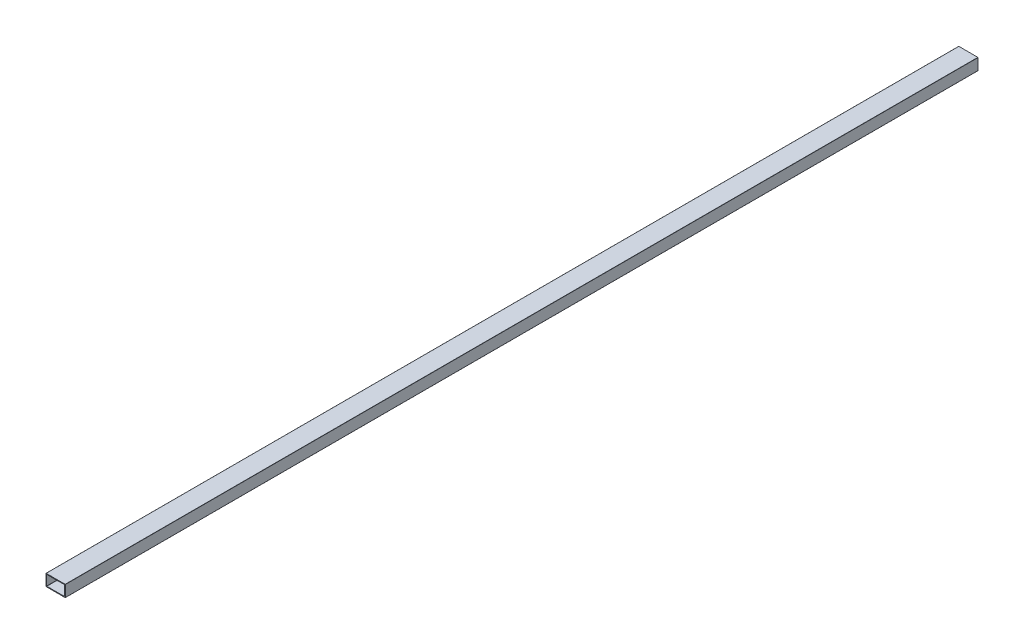
ISO-10303-21;
HEADER;
FILE_DESCRIPTION(('STEP AP214'),'2;1');
FILE_NAME('part.step','',(''),(''),'','','');
FILE_SCHEMA(('AUTOMOTIVE_DESIGN { 1 0 10303 214 1 1 1 1 }'));
ENDSEC;
DATA;
#1=APPLICATION_CONTEXT('core data for automotive mechanical design processes');
#2=APPLICATION_PROTOCOL_DEFINITION('international standard','automotive_design',2000,#1);
#3=PRODUCT_CONTEXT('',#1,'mechanical');
#4=PRODUCT('Part','Part','',(#3));
#5=PRODUCT_RELATED_PRODUCT_CATEGORY('part','',(#4));
#6=PRODUCT_DEFINITION_FORMATION('','',#4);
#7=PRODUCT_DEFINITION_CONTEXT('part definition',#1,'design');
#8=PRODUCT_DEFINITION('design','',#6,#7);
#9=PRODUCT_DEFINITION_SHAPE('','',#8);
#10=(LENGTH_UNIT() NAMED_UNIT(*) SI_UNIT(.MILLI.,.METRE.));
#11=(NAMED_UNIT(*) PLANE_ANGLE_UNIT() SI_UNIT($,.RADIAN.));
#12=(NAMED_UNIT(*) SI_UNIT($,.STERADIAN.) SOLID_ANGLE_UNIT());
#13=UNCERTAINTY_MEASURE_WITH_UNIT(LENGTH_MEASURE(1.E-05),#10,'distance_accuracy_value','');
#14=(GEOMETRIC_REPRESENTATION_CONTEXT(3) GLOBAL_UNCERTAINTY_ASSIGNED_CONTEXT((#13)) GLOBAL_UNIT_ASSIGNED_CONTEXT((#10,
#11,#12)) REPRESENTATION_CONTEXT('',''));
#15=CARTESIAN_POINT('',(0.,0.,0.));
#16=DIRECTION('',(0.,0.,1.));
#17=DIRECTION('',(1.,0.,0.));
#18=AXIS2_PLACEMENT_3D('',#15,#16,#17);
#19=CARTESIAN_POINT('',(63.5,-38.1,-6000.));
#20=DIRECTION('',(1.,0.,0.));
#21=DIRECTION('',(0.,0.,-1.));
#22=AXIS2_PLACEMENT_3D('',#19,#20,#21);
#23=PLANE('',#22);
#24=DIRECTION('',(0.,1.,0.));
#25=VECTOR('',#24,1.);
#26=CARTESIAN_POINT('',(63.5,-38.1,0.));
#27=LINE('',#26,#25);
#28=CARTESIAN_POINT('',(63.5,-37.1,0.));
#29=VERTEX_POINT('',#28);
#30=CARTESIAN_POINT('',(63.5,37.1,0.));
#31=VERTEX_POINT('',#30);
#32=EDGE_CURVE('E197',#29,#31,#27,.T.);
#33=ORIENTED_EDGE('',*,*,#32,.F.);
#34=DIRECTION('',(0.,0.,1.));
#35=VECTOR('',#34,1.);
#36=CARTESIAN_POINT('',(63.5,-37.1,-6000.));
#37=LINE('',#36,#35);
#38=CARTESIAN_POINT('',(63.5,-37.1,-6000.));
#39=VERTEX_POINT('',#38);
#40=EDGE_CURVE('E158',#29,#39,#37,.F.);
#41=ORIENTED_EDGE('',*,*,#40,.T.);
#42=DIRECTION('',(0.,1.,0.));
#43=VECTOR('',#42,1.);
#44=CARTESIAN_POINT('',(63.5,-38.1,-6000.));
#45=LINE('',#44,#43);
#46=CARTESIAN_POINT('',(63.5,37.1,-6000.));
#47=VERTEX_POINT('',#46);
#48=EDGE_CURVE('E185',#39,#47,#45,.T.);
#49=ORIENTED_EDGE('',*,*,#48,.T.);
#50=DIRECTION('',(0.,0.,1.));
#51=VECTOR('',#50,1.);
#52=CARTESIAN_POINT('',(63.5,37.1,-6000.));
#53=LINE('',#52,#51);
#54=EDGE_CURVE('E251',#47,#31,#53,.T.);
#55=ORIENTED_EDGE('',*,*,#54,.T.);
#56=EDGE_LOOP('',(#33,#41,#49,#55));
#57=FACE_BOUND('',#56,.T.);
#58=ADVANCED_FACE('F33',(#57),#23,.T.);
#59=CARTESIAN_POINT('',(-63.5,-38.1,-6000.));
#60=DIRECTION('',(0.,-1.,0.));
#61=DIRECTION('',(0.,0.,-1.));
#62=AXIS2_PLACEMENT_3D('',#59,#60,#61);
#63=PLANE('',#62);
#64=DIRECTION('',(1.,0.,0.));
#65=VECTOR('',#64,1.);
#66=CARTESIAN_POINT('',(-63.5,-38.1,0.));
#67=LINE('',#66,#65);
#68=CARTESIAN_POINT('',(-62.5,-38.1,0.));
#69=VERTEX_POINT('',#68);
#70=CARTESIAN_POINT('',(62.5,-38.1,0.));
#71=VERTEX_POINT('',#70);
#72=EDGE_CURVE('E189',#69,#71,#67,.T.);
#73=ORIENTED_EDGE('',*,*,#72,.F.);
#74=DIRECTION('',(0.,0.,1.));
#75=VECTOR('',#74,1.);
#76=CARTESIAN_POINT('',(-62.5,-38.1,-6000.));
#77=LINE('',#76,#75);
#78=CARTESIAN_POINT('',(-62.5,-38.1,-6000.));
#79=VERTEX_POINT('',#78);
#80=EDGE_CURVE('E238',#69,#79,#77,.F.);
#81=ORIENTED_EDGE('',*,*,#80,.T.);
#82=DIRECTION('',(1.,0.,0.));
#83=VECTOR('',#82,1.);
#84=CARTESIAN_POINT('',(-63.5,-38.1,-6000.));
#85=LINE('',#84,#83);
#86=CARTESIAN_POINT('',(62.5,-38.1,-6000.));
#87=VERTEX_POINT('',#86);
#88=EDGE_CURVE('E194',#79,#87,#85,.T.);
#89=ORIENTED_EDGE('',*,*,#88,.T.);
#90=DIRECTION('',(0.,0.,1.));
#91=VECTOR('',#90,1.);
#92=CARTESIAN_POINT('',(62.5,-38.1,-6000.));
#93=LINE('',#92,#91);
#94=EDGE_CURVE('E235',#87,#71,#93,.T.);
#95=ORIENTED_EDGE('',*,*,#94,.T.);
#96=EDGE_LOOP('',(#73,#81,#89,#95));
#97=FACE_BOUND('',#96,.T.);
#98=ADVANCED_FACE('F305',(#97),#63,.T.);
#99=CARTESIAN_POINT('',(-63.5,-38.1,-6000.));
#100=DIRECTION('',(-1.,0.,0.));
#101=DIRECTION('',(0.,0.,1.));
#102=AXIS2_PLACEMENT_3D('',#99,#100,#101);
#103=PLANE('',#102);
#104=DIRECTION('',(0.,-1.,0.));
#105=VECTOR('',#104,1.);
#106=CARTESIAN_POINT('',(-63.5,-38.1,-6000.));
#107=LINE('',#106,#105);
#108=CARTESIAN_POINT('',(-63.5,37.1,-6000.));
#109=VERTEX_POINT('',#108);
#110=CARTESIAN_POINT('',(-63.5,-37.1,-6000.));
#111=VERTEX_POINT('',#110);
#112=EDGE_CURVE('E191',#109,#111,#107,.T.);
#113=ORIENTED_EDGE('',*,*,#112,.T.);
#114=DIRECTION('',(0.,0.,1.));
#115=VECTOR('',#114,1.);
#116=CARTESIAN_POINT('',(-63.5,-37.1,-6000.));
#117=LINE('',#116,#115);
#118=CARTESIAN_POINT('',(-63.5,-37.1,0.));
#119=VERTEX_POINT('',#118);
#120=EDGE_CURVE('E224',#111,#119,#117,.T.);
#121=ORIENTED_EDGE('',*,*,#120,.T.);
#122=DIRECTION('',(0.,-1.,0.));
#123=VECTOR('',#122,1.);
#124=CARTESIAN_POINT('',(-63.5,-38.1,0.));
#125=LINE('',#124,#123);
#126=CARTESIAN_POINT('',(-63.5,37.1,0.));
#127=VERTEX_POINT('',#126);
#128=EDGE_CURVE('E203',#127,#119,#125,.T.);
#129=ORIENTED_EDGE('',*,*,#128,.F.);
#130=DIRECTION('',(0.,0.,1.));
#131=VECTOR('',#130,1.);
#132=CARTESIAN_POINT('',(-63.5,37.1,-6000.));
#133=LINE('',#132,#131);
#134=EDGE_CURVE('E222',#127,#109,#133,.F.);
#135=ORIENTED_EDGE('',*,*,#134,.T.);
#136=EDGE_LOOP('',(#113,#121,#129,#135));
#137=FACE_BOUND('',#136,.T.);
#138=ADVANCED_FACE('F311',(#137),#103,.T.);
#139=CARTESIAN_POINT('',(-63.5,38.1,-6000.));
#140=DIRECTION('',(0.,1.,0.));
#141=DIRECTION('',(0.,0.,1.));
#142=AXIS2_PLACEMENT_3D('',#139,#140,#141);
#143=PLANE('',#142);
#144=DIRECTION('',(-1.,0.,0.));
#145=VECTOR('',#144,1.);
#146=CARTESIAN_POINT('',(-63.5,38.1,-6000.));
#147=LINE('',#146,#145);
#148=CARTESIAN_POINT('',(62.5,38.1,-6000.));
#149=VERTEX_POINT('',#148);
#150=CARTESIAN_POINT('',(-62.5,38.1,-6000.));
#151=VERTEX_POINT('',#150);
#152=EDGE_CURVE('E188',#149,#151,#147,.T.);
#153=ORIENTED_EDGE('',*,*,#152,.T.);
#154=DIRECTION('',(0.,0.,1.));
#155=VECTOR('',#154,1.);
#156=CARTESIAN_POINT('',(-62.5,38.1,-6000.));
#157=LINE('',#156,#155);
#158=CARTESIAN_POINT('',(-62.5,38.1,0.));
#159=VERTEX_POINT('',#158);
#160=EDGE_CURVE('E248',#151,#159,#157,.T.);
#161=ORIENTED_EDGE('',*,*,#160,.T.);
#162=DIRECTION('',(-1.,0.,0.));
#163=VECTOR('',#162,1.);
#164=CARTESIAN_POINT('',(-63.5,38.1,0.));
#165=LINE('',#164,#163);
#166=CARTESIAN_POINT('',(62.5,38.1,0.));
#167=VERTEX_POINT('',#166);
#168=EDGE_CURVE('E200',#167,#159,#165,.T.);
#169=ORIENTED_EDGE('',*,*,#168,.F.);
#170=DIRECTION('',(0.,0.,1.));
#171=VECTOR('',#170,1.);
#172=CARTESIAN_POINT('',(62.5,38.1,-6000.));
#173=LINE('',#172,#171);
#174=EDGE_CURVE('E55',#167,#149,#173,.F.);
#175=ORIENTED_EDGE('',*,*,#174,.T.);
#176=EDGE_LOOP('',(#153,#161,#169,#175));
#177=FACE_BOUND('',#176,.T.);
#178=ADVANCED_FACE('F316',(#177),#143,.T.);
#179=CARTESIAN_POINT('',(0.,0.,-6000.));
#180=DIRECTION('',(0.,0.,-1.));
#181=DIRECTION('',(-1.,0.,0.));
#182=AXIS2_PLACEMENT_3D('',#179,#180,#181);
#183=PLANE('',#182);
#184=DIRECTION('',(0.,-1.,0.));
#185=VECTOR('',#184,1.);
#186=CARTESIAN_POINT('',(-58.95,-33.55,-6000.));
#187=LINE('',#186,#185);
#188=CARTESIAN_POINT('',(-58.95,32.55,-6000.));
#189=VERTEX_POINT('',#188);
#190=CARTESIAN_POINT('',(-58.95,-32.55,-6000.));
#191=VERTEX_POINT('',#190);
#192=EDGE_CURVE('E167',#189,#191,#187,.T.);
#193=ORIENTED_EDGE('',*,*,#192,.T.);
#194=CARTESIAN_POINT('',(-57.95,-32.55,-6000.));
#195=DIRECTION('',(0.,0.,-1.));
#196=DIRECTION('',(-1.,0.,0.));
#197=AXIS2_PLACEMENT_3D('',#194,#195,#196);
#198=CIRCLE('',#197,1.);
#199=CARTESIAN_POINT('',(-57.95,-33.55,-6000.));
#200=VERTEX_POINT('',#199);
#201=EDGE_CURVE('E11',#191,#200,#198,.F.);
#202=ORIENTED_EDGE('',*,*,#201,.T.);
#203=DIRECTION('',(1.,0.,0.));
#204=VECTOR('',#203,1.);
#205=CARTESIAN_POINT('',(-58.95,-33.55,-6000.));
#206=LINE('',#205,#204);
#207=CARTESIAN_POINT('',(57.95,-33.55,-6000.));
#208=VERTEX_POINT('',#207);
#209=EDGE_CURVE('E175',#200,#208,#206,.T.);
#210=ORIENTED_EDGE('',*,*,#209,.T.);
#211=CARTESIAN_POINT('',(57.95,-32.55,-6000.));
#212=DIRECTION('',(0.,0.,-1.));
#213=DIRECTION('',(-1.,0.,0.));
#214=AXIS2_PLACEMENT_3D('',#211,#212,#213);
#215=CIRCLE('',#214,1.);
#216=CARTESIAN_POINT('',(58.95,-32.55,-6000.));
#217=VERTEX_POINT('',#216);
#218=EDGE_CURVE('E262',#208,#217,#215,.F.);
#219=ORIENTED_EDGE('',*,*,#218,.T.);
#220=DIRECTION('',(0.,1.,0.));
#221=VECTOR('',#220,1.);
#222=CARTESIAN_POINT('',(58.95,-33.55,-6000.));
#223=LINE('',#222,#221);
#224=CARTESIAN_POINT('',(58.95,32.55,-6000.));
#225=VERTEX_POINT('',#224);
#226=EDGE_CURVE('E179',#217,#225,#223,.T.);
#227=ORIENTED_EDGE('',*,*,#226,.T.);
#228=CARTESIAN_POINT('',(57.95,32.55,-6000.));
#229=DIRECTION('',(0.,0.,-1.));
#230=DIRECTION('',(-1.,0.,0.));
#231=AXIS2_PLACEMENT_3D('',#228,#229,#230);
#232=CIRCLE('',#231,1.);
#233=CARTESIAN_POINT('',(57.95,33.55,-6000.));
#234=VERTEX_POINT('',#233);
#235=EDGE_CURVE('E258',#225,#234,#232,.F.);
#236=ORIENTED_EDGE('',*,*,#235,.T.);
#237=DIRECTION('',(-1.,0.,0.));
#238=VECTOR('',#237,1.);
#239=CARTESIAN_POINT('',(-58.95,33.55,-6000.));
#240=LINE('',#239,#238);
#241=CARTESIAN_POINT('',(-57.95,33.55,-6000.));
#242=VERTEX_POINT('',#241);
#243=EDGE_CURVE('E277',#234,#242,#240,.T.);
#244=ORIENTED_EDGE('',*,*,#243,.T.);
#245=CARTESIAN_POINT('',(-57.95,32.55,-6000.));
#246=DIRECTION('',(0.,0.,-1.));
#247=DIRECTION('',(-1.,0.,0.));
#248=AXIS2_PLACEMENT_3D('',#245,#246,#247);
#249=CIRCLE('',#248,1.);
#250=EDGE_CURVE('E157',#242,#189,#249,.F.);
#251=ORIENTED_EDGE('',*,*,#250,.T.);
#252=EDGE_LOOP('',(#193,#202,#210,#219,#227,#236,#244,#251));
#253=FACE_BOUND('',#252,.T.);
#254=ORIENTED_EDGE('',*,*,#88,.F.);
#255=CARTESIAN_POINT('',(-62.5,-37.1,-6000.));
#256=DIRECTION('',(0.,0.,-1.));
#257=DIRECTION('',(-1.,0.,0.));
#258=AXIS2_PLACEMENT_3D('',#255,#256,#257);
#259=CIRCLE('',#258,1.);
#260=EDGE_CURVE('E245',#79,#111,#259,.T.);
#261=ORIENTED_EDGE('',*,*,#260,.T.);
#262=ORIENTED_EDGE('',*,*,#112,.F.);
#263=CARTESIAN_POINT('',(-62.5,37.1,-6000.));
#264=DIRECTION('',(0.,0.,-1.));
#265=DIRECTION('',(-1.,0.,0.));
#266=AXIS2_PLACEMENT_3D('',#263,#264,#265);
#267=CIRCLE('',#266,1.);
#268=EDGE_CURVE('E48',#109,#151,#267,.T.);
#269=ORIENTED_EDGE('',*,*,#268,.T.);
#270=ORIENTED_EDGE('',*,*,#152,.F.);
#271=CARTESIAN_POINT('',(62.5,37.1,-6000.));
#272=DIRECTION('',(0.,0.,-1.));
#273=DIRECTION('',(-1.,0.,0.));
#274=AXIS2_PLACEMENT_3D('',#271,#272,#273);
#275=CIRCLE('',#274,1.);
#276=EDGE_CURVE('E240',#149,#47,#275,.T.);
#277=ORIENTED_EDGE('',*,*,#276,.T.);
#278=ORIENTED_EDGE('',*,*,#48,.F.);
#279=CARTESIAN_POINT('',(62.5,-37.1,-6000.));
#280=DIRECTION('',(0.,0.,-1.));
#281=DIRECTION('',(-1.,0.,0.));
#282=AXIS2_PLACEMENT_3D('',#279,#280,#281);
#283=CIRCLE('',#282,1.);
#284=EDGE_CURVE('E242',#39,#87,#283,.T.);
#285=ORIENTED_EDGE('',*,*,#284,.T.);
#286=EDGE_LOOP('',(#254,#261,#262,#269,#270,#277,#278,#285));
#287=FACE_BOUND('',#286,.T.);
#288=ADVANCED_FACE('F267',(#253,#287),#183,.T.);
#289=CARTESIAN_POINT('',(0.,0.,0.));
#290=DIRECTION('',(0.,0.,-1.));
#291=DIRECTION('',(-1.,0.,0.));
#292=AXIS2_PLACEMENT_3D('',#289,#290,#291);
#293=PLANE('',#292);
#294=DIRECTION('',(0.,1.,0.));
#295=VECTOR('',#294,1.);
#296=CARTESIAN_POINT('',(58.95,-33.55,0.));
#297=LINE('',#296,#295);
#298=CARTESIAN_POINT('',(58.95,-32.55,0.));
#299=VERTEX_POINT('',#298);
#300=CARTESIAN_POINT('',(58.95,32.55,0.));
#301=VERTEX_POINT('',#300);
#302=EDGE_CURVE('E181',#299,#301,#297,.T.);
#303=ORIENTED_EDGE('',*,*,#302,.F.);
#304=CARTESIAN_POINT('',(57.95,-32.55,0.));
#305=DIRECTION('',(0.,0.,-1.));
#306=DIRECTION('',(-1.,0.,0.));
#307=AXIS2_PLACEMENT_3D('',#304,#305,#306);
#308=CIRCLE('',#307,1.);
#309=CARTESIAN_POINT('',(57.95,-33.55,0.));
#310=VERTEX_POINT('',#309);
#311=EDGE_CURVE('E260',#299,#310,#308,.T.);
#312=ORIENTED_EDGE('',*,*,#311,.T.);
#313=DIRECTION('',(1.,0.,0.));
#314=VECTOR('',#313,1.);
#315=CARTESIAN_POINT('',(-58.95,-33.55,0.));
#316=LINE('',#315,#314);
#317=CARTESIAN_POINT('',(-57.95,-33.55,0.));
#318=VERTEX_POINT('',#317);
#319=EDGE_CURVE('E281',#318,#310,#316,.T.);
#320=ORIENTED_EDGE('',*,*,#319,.F.);
#321=CARTESIAN_POINT('',(-57.95,-32.55,0.));
#322=DIRECTION('',(0.,0.,-1.));
#323=DIRECTION('',(-1.,0.,0.));
#324=AXIS2_PLACEMENT_3D('',#321,#322,#323);
#325=CIRCLE('',#324,1.);
#326=CARTESIAN_POINT('',(-58.95,-32.55,0.));
#327=VERTEX_POINT('',#326);
#328=EDGE_CURVE('E41',#318,#327,#325,.T.);
#329=ORIENTED_EDGE('',*,*,#328,.T.);
#330=DIRECTION('',(0.,-1.,0.));
#331=VECTOR('',#330,1.);
#332=CARTESIAN_POINT('',(-58.95,-33.55,0.));
#333=LINE('',#332,#331);
#334=CARTESIAN_POINT('',(-58.95,32.55,0.));
#335=VERTEX_POINT('',#334);
#336=EDGE_CURVE('E164',#335,#327,#333,.T.);
#337=ORIENTED_EDGE('',*,*,#336,.F.);
#338=CARTESIAN_POINT('',(-57.95,32.55,0.));
#339=DIRECTION('',(0.,0.,-1.));
#340=DIRECTION('',(-1.,0.,0.));
#341=AXIS2_PLACEMENT_3D('',#338,#339,#340);
#342=CIRCLE('',#341,1.);
#343=CARTESIAN_POINT('',(-57.95,33.55,0.));
#344=VERTEX_POINT('',#343);
#345=EDGE_CURVE('E147',#335,#344,#342,.T.);
#346=ORIENTED_EDGE('',*,*,#345,.T.);
#347=DIRECTION('',(-1.,0.,0.));
#348=VECTOR('',#347,1.);
#349=CARTESIAN_POINT('',(-58.95,33.55,0.));
#350=LINE('',#349,#348);
#351=CARTESIAN_POINT('',(57.95,33.55,0.));
#352=VERTEX_POINT('',#351);
#353=EDGE_CURVE('E176',#352,#344,#350,.T.);
#354=ORIENTED_EDGE('',*,*,#353,.F.);
#355=CARTESIAN_POINT('',(57.95,32.55,0.));
#356=DIRECTION('',(0.,0.,-1.));
#357=DIRECTION('',(-1.,0.,0.));
#358=AXIS2_PLACEMENT_3D('',#355,#356,#357);
#359=CIRCLE('',#358,1.);
#360=EDGE_CURVE('E256',#352,#301,#359,.T.);
#361=ORIENTED_EDGE('',*,*,#360,.T.);
#362=EDGE_LOOP('',(#303,#312,#320,#329,#337,#346,#354,#361));
#363=FACE_BOUND('',#362,.T.);
#364=ORIENTED_EDGE('',*,*,#128,.T.);
#365=CARTESIAN_POINT('',(-62.5,-37.1,0.));
#366=DIRECTION('',(0.,0.,-1.));
#367=DIRECTION('',(-1.,0.,0.));
#368=AXIS2_PLACEMENT_3D('',#365,#366,#367);
#369=CIRCLE('',#368,1.);
#370=EDGE_CURVE('E233',#119,#69,#369,.F.);
#371=ORIENTED_EDGE('',*,*,#370,.T.);
#372=ORIENTED_EDGE('',*,*,#72,.T.);
#373=CARTESIAN_POINT('',(62.5,-37.1,0.));
#374=DIRECTION('',(0.,0.,-1.));
#375=DIRECTION('',(-1.,0.,0.));
#376=AXIS2_PLACEMENT_3D('',#373,#374,#375);
#377=CIRCLE('',#376,1.);
#378=EDGE_CURVE('E229',#71,#29,#377,.F.);
#379=ORIENTED_EDGE('',*,*,#378,.T.);
#380=ORIENTED_EDGE('',*,*,#32,.T.);
#381=CARTESIAN_POINT('',(62.5,37.1,0.));
#382=DIRECTION('',(0.,0.,-1.));
#383=DIRECTION('',(-1.,0.,0.));
#384=AXIS2_PLACEMENT_3D('',#381,#382,#383);
#385=CIRCLE('',#384,1.);
#386=EDGE_CURVE('E227',#31,#167,#385,.F.);
#387=ORIENTED_EDGE('',*,*,#386,.T.);
#388=ORIENTED_EDGE('',*,*,#168,.T.);
#389=CARTESIAN_POINT('',(-62.5,37.1,0.));
#390=DIRECTION('',(0.,0.,-1.));
#391=DIRECTION('',(-1.,0.,0.));
#392=AXIS2_PLACEMENT_3D('',#389,#390,#391);
#393=CIRCLE('',#392,1.);
#394=EDGE_CURVE('E231',#159,#127,#393,.F.);
#395=ORIENTED_EDGE('',*,*,#394,.T.);
#396=EDGE_LOOP('',(#364,#371,#372,#379,#380,#387,#388,#395));
#397=FACE_BOUND('',#396,.T.);
#398=ADVANCED_FACE('F172',(#363,#397),#293,.F.);
#399=CARTESIAN_POINT('',(-58.95,-33.55,-6000.));
#400=DIRECTION('',(0.,-1.,0.));
#401=DIRECTION('',(0.,0.,-1.));
#402=AXIS2_PLACEMENT_3D('',#399,#400,#401);
#403=PLANE('',#402);
#404=ORIENTED_EDGE('',*,*,#319,.T.);
#405=DIRECTION('',(0.,0.,1.));
#406=VECTOR('',#405,1.);
#407=CARTESIAN_POINT('',(57.95,-33.55,-6000.));
#408=LINE('',#407,#406);
#409=EDGE_CURVE('E220',#310,#208,#408,.F.);
#410=ORIENTED_EDGE('',*,*,#409,.T.);
#411=ORIENTED_EDGE('',*,*,#209,.F.);
#412=DIRECTION('',(0.,0.,1.));
#413=VECTOR('',#412,1.);
#414=CARTESIAN_POINT('',(-57.95,-33.55,0.));
#415=LINE('',#414,#413);
#416=EDGE_CURVE('E217',#200,#318,#415,.T.);
#417=ORIENTED_EDGE('',*,*,#416,.T.);
#418=EDGE_LOOP('',(#404,#410,#411,#417));
#419=FACE_BOUND('',#418,.T.);
#420=ADVANCED_FACE('F283',(#419),#403,.F.);
#421=CARTESIAN_POINT('',(-58.95,-33.55,-6000.));
#422=DIRECTION('',(-1.,0.,0.));
#423=DIRECTION('',(0.,0.,1.));
#424=AXIS2_PLACEMENT_3D('',#421,#422,#423);
#425=PLANE('',#424);
#426=ORIENTED_EDGE('',*,*,#192,.F.);
#427=DIRECTION('',(0.,0.,1.));
#428=VECTOR('',#427,1.);
#429=CARTESIAN_POINT('',(-58.95,32.55,0.));
#430=LINE('',#429,#428);
#431=EDGE_CURVE('E151',#189,#335,#430,.T.);
#432=ORIENTED_EDGE('',*,*,#431,.T.);
#433=ORIENTED_EDGE('',*,*,#336,.T.);
#434=DIRECTION('',(0.,0.,1.));
#435=VECTOR('',#434,1.);
#436=CARTESIAN_POINT('',(-58.95,-32.55,-6000.));
#437=LINE('',#436,#435);
#438=EDGE_CURVE('E169',#327,#191,#437,.F.);
#439=ORIENTED_EDGE('',*,*,#438,.T.);
#440=EDGE_LOOP('',(#426,#432,#433,#439));
#441=FACE_BOUND('',#440,.T.);
#442=ADVANCED_FACE('F163',(#441),#425,.F.);
#443=CARTESIAN_POINT('',(-58.95,33.55,-6000.));
#444=DIRECTION('',(0.,1.,0.));
#445=DIRECTION('',(0.,0.,1.));
#446=AXIS2_PLACEMENT_3D('',#443,#444,#445);
#447=PLANE('',#446);
#448=ORIENTED_EDGE('',*,*,#353,.T.);
#449=DIRECTION('',(0.,0.,1.));
#450=VECTOR('',#449,1.);
#451=CARTESIAN_POINT('',(-57.95,33.55,-6000.));
#452=LINE('',#451,#450);
#453=EDGE_CURVE('E152',#344,#242,#452,.F.);
#454=ORIENTED_EDGE('',*,*,#453,.T.);
#455=ORIENTED_EDGE('',*,*,#243,.F.);
#456=DIRECTION('',(0.,0.,1.));
#457=VECTOR('',#456,1.);
#458=CARTESIAN_POINT('',(57.95,33.55,0.));
#459=LINE('',#458,#457);
#460=EDGE_CURVE('E168',#234,#352,#459,.T.);
#461=ORIENTED_EDGE('',*,*,#460,.T.);
#462=EDGE_LOOP('',(#448,#454,#455,#461));
#463=FACE_BOUND('',#462,.T.);
#464=ADVANCED_FACE('F292',(#463),#447,.F.);
#465=CARTESIAN_POINT('',(58.95,-33.55,-6000.));
#466=DIRECTION('',(1.,0.,0.));
#467=DIRECTION('',(0.,0.,-1.));
#468=AXIS2_PLACEMENT_3D('',#465,#466,#467);
#469=PLANE('',#468);
#470=ORIENTED_EDGE('',*,*,#302,.T.);
#471=DIRECTION('',(0.,0.,1.));
#472=VECTOR('',#471,1.);
#473=CARTESIAN_POINT('',(58.95,32.55,-6000.));
#474=LINE('',#473,#472);
#475=EDGE_CURVE('E215',#301,#225,#474,.F.);
#476=ORIENTED_EDGE('',*,*,#475,.T.);
#477=ORIENTED_EDGE('',*,*,#226,.F.);
#478=DIRECTION('',(0.,0.,1.));
#479=VECTOR('',#478,1.);
#480=CARTESIAN_POINT('',(58.95,-32.55,0.));
#481=LINE('',#480,#479);
#482=EDGE_CURVE('E212',#217,#299,#481,.T.);
#483=ORIENTED_EDGE('',*,*,#482,.T.);
#484=EDGE_LOOP('',(#470,#476,#477,#483));
#485=FACE_BOUND('',#484,.T.);
#486=ADVANCED_FACE('F275',(#485),#469,.F.);
#487=CARTESIAN_POINT('',(-57.95,32.55,-6000.));
#488=DIRECTION('',(0.,0.,-1.));
#489=DIRECTION('',(-1.,0.,0.));
#490=AXIS2_PLACEMENT_3D('',#487,#488,#489);
#491=CYLINDRICAL_SURFACE('',#490,1.);
#492=ORIENTED_EDGE('',*,*,#250,.F.);
#493=ORIENTED_EDGE('',*,*,#453,.F.);
#494=ORIENTED_EDGE('',*,*,#345,.F.);
#495=ORIENTED_EDGE('',*,*,#431,.F.);
#496=EDGE_LOOP('',(#492,#493,#494,#495));
#497=FACE_BOUND('',#496,.T.);
#498=ADVANCED_FACE('F150',(#497),#491,.F.);
#499=CARTESIAN_POINT('',(57.95,32.55,-6000.));
#500=DIRECTION('',(0.,0.,-1.));
#501=DIRECTION('',(-1.,0.,0.));
#502=AXIS2_PLACEMENT_3D('',#499,#500,#501);
#503=CYLINDRICAL_SURFACE('',#502,1.);
#504=ORIENTED_EDGE('',*,*,#235,.F.);
#505=ORIENTED_EDGE('',*,*,#475,.F.);
#506=ORIENTED_EDGE('',*,*,#360,.F.);
#507=ORIENTED_EDGE('',*,*,#460,.F.);
#508=EDGE_LOOP('',(#504,#505,#506,#507));
#509=FACE_BOUND('',#508,.T.);
#510=ADVANCED_FACE('F294',(#509),#503,.F.);
#511=CARTESIAN_POINT('',(57.95,-32.55,-6000.));
#512=DIRECTION('',(0.,0.,-1.));
#513=DIRECTION('',(-1.,0.,0.));
#514=AXIS2_PLACEMENT_3D('',#511,#512,#513);
#515=CYLINDRICAL_SURFACE('',#514,1.);
#516=ORIENTED_EDGE('',*,*,#218,.F.);
#517=ORIENTED_EDGE('',*,*,#409,.F.);
#518=ORIENTED_EDGE('',*,*,#311,.F.);
#519=ORIENTED_EDGE('',*,*,#482,.F.);
#520=EDGE_LOOP('',(#516,#517,#518,#519));
#521=FACE_BOUND('',#520,.T.);
#522=ADVANCED_FACE('F279',(#521),#515,.F.);
#523=CARTESIAN_POINT('',(-62.5,-37.1,-6000.));
#524=DIRECTION('',(0.,0.,1.));
#525=DIRECTION('',(1.,0.,0.));
#526=AXIS2_PLACEMENT_3D('',#523,#524,#525);
#527=CYLINDRICAL_SURFACE('',#526,1.);
#528=ORIENTED_EDGE('',*,*,#260,.F.);
#529=ORIENTED_EDGE('',*,*,#80,.F.);
#530=ORIENTED_EDGE('',*,*,#370,.F.);
#531=ORIENTED_EDGE('',*,*,#120,.F.);
#532=EDGE_LOOP('',(#528,#529,#530,#531));
#533=FACE_BOUND('',#532,.T.);
#534=ADVANCED_FACE('F301',(#533),#527,.T.);
#535=CARTESIAN_POINT('',(-62.5,37.1,-6000.));
#536=DIRECTION('',(0.,0.,1.));
#537=DIRECTION('',(1.,0.,0.));
#538=AXIS2_PLACEMENT_3D('',#535,#536,#537);
#539=CYLINDRICAL_SURFACE('',#538,1.);
#540=ORIENTED_EDGE('',*,*,#268,.F.);
#541=ORIENTED_EDGE('',*,*,#134,.F.);
#542=ORIENTED_EDGE('',*,*,#394,.F.);
#543=ORIENTED_EDGE('',*,*,#160,.F.);
#544=EDGE_LOOP('',(#540,#541,#542,#543));
#545=FACE_BOUND('',#544,.T.);
#546=ADVANCED_FACE('F368',(#545),#539,.T.);
#547=CARTESIAN_POINT('',(-57.95,-32.55,-6000.));
#548=DIRECTION('',(0.,0.,-1.));
#549=DIRECTION('',(-1.,0.,0.));
#550=AXIS2_PLACEMENT_3D('',#547,#548,#549);
#551=CYLINDRICAL_SURFACE('',#550,1.);
#552=ORIENTED_EDGE('',*,*,#201,.F.);
#553=ORIENTED_EDGE('',*,*,#438,.F.);
#554=ORIENTED_EDGE('',*,*,#328,.F.);
#555=ORIENTED_EDGE('',*,*,#416,.F.);
#556=EDGE_LOOP('',(#552,#553,#554,#555));
#557=FACE_BOUND('',#556,.T.);
#558=ADVANCED_FACE('F378',(#557),#551,.F.);
#559=CARTESIAN_POINT('',(62.5,-37.1,-6000.));
#560=DIRECTION('',(0.,0.,1.));
#561=DIRECTION('',(1.,0.,0.));
#562=AXIS2_PLACEMENT_3D('',#559,#560,#561);
#563=CYLINDRICAL_SURFACE('',#562,1.);
#564=ORIENTED_EDGE('',*,*,#284,.F.);
#565=ORIENTED_EDGE('',*,*,#40,.F.);
#566=ORIENTED_EDGE('',*,*,#378,.F.);
#567=ORIENTED_EDGE('',*,*,#94,.F.);
#568=EDGE_LOOP('',(#564,#565,#566,#567));
#569=FACE_BOUND('',#568,.T.);
#570=ADVANCED_FACE('F388',(#569),#563,.T.);
#571=CARTESIAN_POINT('',(62.5,37.1,-6000.));
#572=DIRECTION('',(0.,0.,1.));
#573=DIRECTION('',(1.,0.,0.));
#574=AXIS2_PLACEMENT_3D('',#571,#572,#573);
#575=CYLINDRICAL_SURFACE('',#574,1.);
#576=ORIENTED_EDGE('',*,*,#276,.F.);
#577=ORIENTED_EDGE('',*,*,#174,.F.);
#578=ORIENTED_EDGE('',*,*,#386,.F.);
#579=ORIENTED_EDGE('',*,*,#54,.F.);
#580=EDGE_LOOP('',(#576,#577,#578,#579));
#581=FACE_BOUND('',#580,.T.);
#582=ADVANCED_FACE('F35',(#581),#575,.T.);
#583=CLOSED_SHELL('',(#58,#98,#138,#178,#288,#398,#420,#442,#464,#486,#498,#510,#522,#534,#546,
#558,#570,#582));
#584=MANIFOLD_SOLID_BREP('B2',#583);
#585=ADVANCED_BREP_SHAPE_REPRESENTATION('',(#18,#584),#14);
#586=SHAPE_DEFINITION_REPRESENTATION(#9,#585);
ENDSEC;
END-ISO-10303-21;
